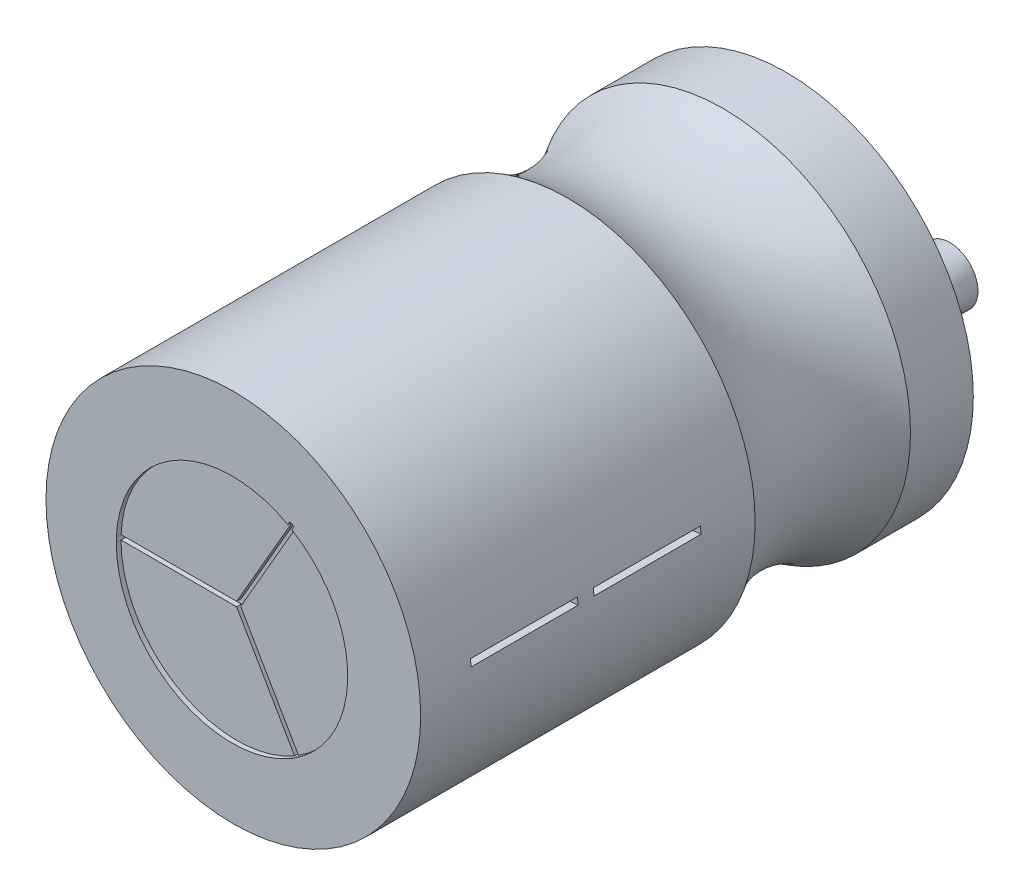
ISO-10303-21;
HEADER;
FILE_DESCRIPTION(('STEP AP214'),'2;1');
FILE_NAME('part.step','',(''),(''),'','','');
FILE_SCHEMA(('AUTOMOTIVE_DESIGN { 1 0 10303 214 1 1 1 1 }'));
ENDSEC;
DATA;
#1=APPLICATION_CONTEXT('core data for automotive mechanical design processes');
#2=APPLICATION_PROTOCOL_DEFINITION('international standard','automotive_design',2000,#1);
#3=PRODUCT_CONTEXT('',#1,'mechanical');
#4=PRODUCT('Part','Part','',(#3));
#5=PRODUCT_RELATED_PRODUCT_CATEGORY('part','',(#4));
#6=PRODUCT_DEFINITION_FORMATION('','',#4);
#7=PRODUCT_DEFINITION_CONTEXT('part definition',#1,'design');
#8=PRODUCT_DEFINITION('design','',#6,#7);
#9=PRODUCT_DEFINITION_SHAPE('','',#8);
#10=(LENGTH_UNIT() NAMED_UNIT(*) SI_UNIT(.MILLI.,.METRE.));
#11=(NAMED_UNIT(*) PLANE_ANGLE_UNIT() SI_UNIT($,.RADIAN.));
#12=(NAMED_UNIT(*) SI_UNIT($,.STERADIAN.) SOLID_ANGLE_UNIT());
#13=UNCERTAINTY_MEASURE_WITH_UNIT(LENGTH_MEASURE(1.E-05),#10,'distance_accuracy_value','');
#14=(GEOMETRIC_REPRESENTATION_CONTEXT(3) GLOBAL_UNCERTAINTY_ASSIGNED_CONTEXT((#13)) GLOBAL_UNIT_ASSIGNED_CONTEXT((#10,
#11,#12)) REPRESENTATION_CONTEXT('',''));
#15=CARTESIAN_POINT('',(0.,0.,0.));
#16=DIRECTION('',(0.,0.,1.));
#17=DIRECTION('',(1.,0.,0.));
#18=AXIS2_PLACEMENT_3D('',#15,#16,#17);
#19=CARTESIAN_POINT('',(3.82844775003185,-6.73106601717805,11.6));
#20=DIRECTION('',(-0.866025403784443,-0.499999999999992,0.));
#21=DIRECTION('',(0.499999999999992,-0.866025403784443,0.));
#22=AXIS2_PLACEMENT_3D('',#19,#20,#21);
#23=PLANE('',#22);
#24=DIRECTION('',(-0.499999999999992,0.866025403784443,0.));
#25=VECTOR('',#24,1.);
#26=CARTESIAN_POINT('',(3.82844775003185,-6.73106601717805,11.7));
#27=LINE('',#26,#25);
#28=CARTESIAN_POINT('',(1.20644870480576,-2.18963045344928,11.7));
#29=VERTEX_POINT('',#28);
#30=CARTESIAN_POINT('',(-0.0288675134594817,-0.0499999999999997,11.7));
#31=VERTEX_POINT('',#30);
#32=EDGE_CURVE('E344',#29,#31,#27,.T.);
#33=ORIENTED_EDGE('',*,*,#32,.F.);
#34=DIRECTION('',(0.,0.,1.));
#35=VECTOR('',#34,1.);
#36=CARTESIAN_POINT('',(1.20644870480576,-2.18963045344928,11.6));
#37=LINE('',#36,#35);
#38=CARTESIAN_POINT('',(1.20644870480576,-2.18963045344928,11.6));
#39=VERTEX_POINT('',#38);
#40=EDGE_CURVE('E457',#39,#29,#37,.T.);
#41=ORIENTED_EDGE('',*,*,#40,.F.);
#42=DIRECTION('',(0.499999999999992,-0.866025403784443,0.));
#43=VECTOR('',#42,1.);
#44=CARTESIAN_POINT('',(3.82844775003185,-6.73106601717805,11.6));
#45=LINE('',#44,#43);
#46=CARTESIAN_POINT('',(-0.0288675134594817,-0.0499999999999988,11.6));
#47=VERTEX_POINT('',#46);
#48=EDGE_CURVE('E396',#47,#39,#45,.T.);
#49=ORIENTED_EDGE('',*,*,#48,.F.);
#50=DIRECTION('',(0.,0.,1.));
#51=VECTOR('',#50,1.);
#52=CARTESIAN_POINT('',(-0.0288675134594817,-0.0499999999999988,11.6));
#53=LINE('',#52,#51);
#54=EDGE_CURVE('E461',#47,#31,#53,.T.);
#55=ORIENTED_EDGE('',*,*,#54,.T.);
#56=EDGE_LOOP('',(#33,#41,#49,#55));
#57=FACE_BOUND('',#56,.T.);
#58=ADVANCED_FACE('F78',(#57),#23,.F.);
#59=CARTESIAN_POINT('',(0.,-0.0499999999999997,11.6));
#60=DIRECTION('',(0.,1.,0.));
#61=DIRECTION('',(-1.,0.,0.));
#62=AXIS2_PLACEMENT_3D('',#59,#60,#61);
#63=PLANE('',#62);
#64=DIRECTION('',(0.,0.,1.));
#65=VECTOR('',#64,1.);
#66=CARTESIAN_POINT('',(-2.49949994999,-0.0499999999999994,11.6));
#67=LINE('',#66,#65);
#68=CARTESIAN_POINT('',(-2.49949994999,-0.0499999999999994,11.6));
#69=VERTEX_POINT('',#68);
#70=CARTESIAN_POINT('',(-2.49949994999,-0.0499999999999994,11.7));
#71=VERTEX_POINT('',#70);
#72=EDGE_CURVE('E465',#69,#71,#67,.T.);
#73=ORIENTED_EDGE('',*,*,#72,.T.);
#74=DIRECTION('',(1.,0.,0.));
#75=VECTOR('',#74,1.);
#76=CARTESIAN_POINT('',(0.,-0.0499999999999997,11.7));
#77=LINE('',#76,#75);
#78=EDGE_CURVE('E340',#71,#31,#77,.T.);
#79=ORIENTED_EDGE('',*,*,#78,.T.);
#80=ORIENTED_EDGE('',*,*,#54,.F.);
#81=DIRECTION('',(-1.,0.,0.));
#82=VECTOR('',#81,1.);
#83=CARTESIAN_POINT('',(0.,-0.0499999999999997,11.6));
#84=LINE('',#83,#82);
#85=EDGE_CURVE('E393',#47,#69,#84,.T.);
#86=ORIENTED_EDGE('',*,*,#85,.T.);
#87=EDGE_LOOP('',(#73,#79,#80,#86));
#88=FACE_BOUND('',#87,.T.);
#89=ADVANCED_FACE('F550',(#88),#63,.T.);
#90=CARTESIAN_POINT('',(0.,0.,0.));
#91=DIRECTION('',(0.,0.,1.));
#92=DIRECTION('',(1.,0.,0.));
#93=AXIS2_PLACEMENT_3D('',#90,#91,#92);
#94=PLANE('',#93);
#95=CARTESIAN_POINT('',(-1.50000000000006,0.,0.));
#96=DIRECTION('',(0.,0.,1.));
#97=DIRECTION('',(1.,0.,0.));
#98=AXIS2_PLACEMENT_3D('',#95,#96,#97);
#99=CIRCLE('',#98,0.6);
#100=CARTESIAN_POINT('',(-0.900000000000057,0.,0.));
#101=VERTEX_POINT('',#100);
#102=EDGE_CURVE('E480',#101,#101,#99,.F.);
#103=ORIENTED_EDGE('',*,*,#102,.F.);
#104=EDGE_LOOP('',(#103));
#105=FACE_BOUND('',#104,.T.);
#106=CARTESIAN_POINT('',(0.,0.,0.));
#107=DIRECTION('',(0.,0.,1.));
#108=DIRECTION('',(1.,0.,0.));
#109=AXIS2_PLACEMENT_3D('',#106,#107,#108);
#110=CIRCLE('',#109,4.);
#111=CARTESIAN_POINT('',(4.,0.,0.));
#112=VERTEX_POINT('',#111);
#113=EDGE_CURVE('E476',#112,#112,#110,.T.);
#114=ORIENTED_EDGE('',*,*,#113,.F.);
#115=EDGE_LOOP('',(#114));
#116=FACE_BOUND('',#115,.T.);
#117=CARTESIAN_POINT('',(1.50000000000006,0.,0.));
#118=DIRECTION('',(0.,0.,1.));
#119=DIRECTION('',(1.,0.,0.));
#120=AXIS2_PLACEMENT_3D('',#117,#118,#119);
#121=CIRCLE('',#120,0.6);
#122=CARTESIAN_POINT('',(2.10000000000006,0.,0.));
#123=VERTEX_POINT('',#122);
#124=EDGE_CURVE('E492',#123,#123,#121,.F.);
#125=ORIENTED_EDGE('',*,*,#124,.F.);
#126=EDGE_LOOP('',(#125));
#127=FACE_BOUND('',#126,.T.);
#128=ADVANCED_FACE('F568',(#105,#116,#127),#94,.F.);
#129=CARTESIAN_POINT('',(0.,0.,11.8));
#130=DIRECTION('',(0.,0.,1.));
#131=DIRECTION('',(1.,0.,0.));
#132=AXIS2_PLACEMENT_3D('',#129,#130,#131);
#133=PLANE('',#132);
#134=CARTESIAN_POINT('',(-0.0288675134594817,-0.0499999999999988,11.8));
#135=DIRECTION('',(0.,0.,1.));
#136=DIRECTION('',(1.,0.,0.));
#137=AXIS2_PLACEMENT_3D('',#134,#135,#136);
#138=CIRCLE('',#137,2.47063243653052);
#139=CARTESIAN_POINT('',(1.1628944370446,2.11419224880034,11.8));
#140=VERTEX_POINT('',#139);
#141=CARTESIAN_POINT('',(-2.4974753471254,0.0499999999999994,11.8));
#142=VERTEX_POINT('',#141);
#143=EDGE_CURVE('E331',#140,#142,#138,.T.);
#144=ORIENTED_EDGE('',*,*,#143,.F.);
#145=DIRECTION('',(0.50000000000002,0.866025403784427,0.));
#146=VECTOR('',#145,1.);
#147=CARTESIAN_POINT('',(-3.91505029041043,-6.6810660171778,11.8));
#148=LINE('',#147,#146);
#149=CARTESIAN_POINT('',(1.20644870480583,2.18963045344925,11.8));
#150=VERTEX_POINT('',#149);
#151=EDGE_CURVE('E416',#140,#150,#148,.T.);
#152=ORIENTED_EDGE('',*,*,#151,.T.);
#153=CARTESIAN_POINT('',(0.,0.,11.8));
#154=DIRECTION('',(0.,0.,1.));
#155=DIRECTION('',(1.,0.,0.));
#156=AXIS2_PLACEMENT_3D('',#153,#154,#155);
#157=CIRCLE('',#156,2.5);
#158=CARTESIAN_POINT('',(1.29305124518423,2.13963045344927,11.8));
#159=VERTEX_POINT('',#158);
#160=EDGE_CURVE('E385',#159,#150,#157,.T.);
#161=ORIENTED_EDGE('',*,*,#160,.F.);
#162=DIRECTION('',(0.500000000000004,0.866025403784436,0.));
#163=VECTOR('',#162,1.);
#164=CARTESIAN_POINT('',(-3.82844775003191,-6.73106601717795,11.8));
#165=LINE('',#164,#163);
#166=CARTESIAN_POINT('',(1.249496977423,2.06419224880036,11.8));
#167=VERTEX_POINT('',#166);
#168=EDGE_CURVE('E434',#167,#159,#165,.T.);
#169=ORIENTED_EDGE('',*,*,#168,.F.);
#170=CARTESIAN_POINT('',(1.29203894375187,-2.13787709593598,11.8));
#171=VERTEX_POINT('',#170);
#172=EDGE_CURVE('E323',#171,#167,#138,.T.);
#173=ORIENTED_EDGE('',*,*,#172,.F.);
#174=DIRECTION('',(0.49999999999998,-0.86602540378445,0.));
#175=VECTOR('',#174,1.);
#176=CARTESIAN_POINT('',(3.91505029041023,-6.68106601717817,11.8));
#177=LINE('',#176,#175);
#178=CARTESIAN_POINT('',(1.29305124518417,-2.1396304534493,11.8));
#179=VERTEX_POINT('',#178);
#180=EDGE_CURVE('E431',#171,#179,#177,.T.);
#181=ORIENTED_EDGE('',*,*,#180,.T.);
#182=CARTESIAN_POINT('',(0.,0.,11.8));
#183=DIRECTION('',(0.,0.,1.));
#184=DIRECTION('',(1.,0.,0.));
#185=AXIS2_PLACEMENT_3D('',#182,#183,#184);
#186=CIRCLE('',#185,2.5);
#187=CARTESIAN_POINT('',(1.20644870480576,-2.18963045344928,11.8));
#188=VERTEX_POINT('',#187);
#189=EDGE_CURVE('E427',#188,#179,#186,.T.);
#190=ORIENTED_EDGE('',*,*,#189,.F.);
#191=CARTESIAN_POINT('',(-2.49949994999,-0.0499999999998698,11.8));
#192=VERTEX_POINT('',#191);
#193=EDGE_CURVE('E335',#192,#188,#138,.T.);
#194=ORIENTED_EDGE('',*,*,#193,.F.);
#195=CARTESIAN_POINT('',(0.,0.,11.8));
#196=DIRECTION('',(0.,0.,1.));
#197=DIRECTION('',(1.,0.,0.));
#198=AXIS2_PLACEMENT_3D('',#195,#196,#197);
#199=CIRCLE('',#198,2.5);
#200=CARTESIAN_POINT('',(-2.49949994999,0.0499999999999994,11.8));
#201=VERTEX_POINT('',#200);
#202=EDGE_CURVE('E423',#201,#192,#199,.T.);
#203=ORIENTED_EDGE('',*,*,#202,.F.);
#204=DIRECTION('',(-1.,0.,0.));
#205=VECTOR('',#204,1.);
#206=CARTESIAN_POINT('',(0.,0.0499999999999997,11.8));
#207=LINE('',#206,#205);
#208=EDGE_CURVE('E419',#142,#201,#207,.T.);
#209=ORIENTED_EDGE('',*,*,#208,.F.);
#210=EDGE_LOOP('',(#144,#152,#161,#169,#173,#181,#190,#194,#203,#209));
#211=FACE_BOUND('',#210,.T.);
#212=CARTESIAN_POINT('',(0.,0.,11.8));
#213=DIRECTION('',(0.,0.,1.));
#214=DIRECTION('',(1.,0.,0.));
#215=AXIS2_PLACEMENT_3D('',#212,#213,#214);
#216=CIRCLE('',#215,4.);
#217=CARTESIAN_POINT('',(4.,0.,11.8));
#218=VERTEX_POINT('',#217);
#219=EDGE_CURVE('E444',#218,#218,#216,.T.);
#220=ORIENTED_EDGE('',*,*,#219,.T.);
#221=EDGE_LOOP('',(#220));
#222=FACE_BOUND('',#221,.T.);
#223=ADVANCED_FACE('F520',(#211,#222),#133,.T.);
#224=CARTESIAN_POINT('',(0.,0.,12.));
#225=DIRECTION('',(0.,0.,-1.));
#226=DIRECTION('',(-1.,0.,0.));
#227=AXIS2_PLACEMENT_3D('',#224,#225,#226);
#228=CYLINDRICAL_SURFACE('',#227,4.);
#229=CARTESIAN_POINT('',(0.,0.,8.08332286425552));
#230=DIRECTION('',(0.,0.,-1.));
#231=DIRECTION('',(0.996234762972635,0.0866965803527307,0.));
#232=AXIS2_PLACEMENT_3D('',#229,#230,#231);
#233=CIRCLE('',#232,4.);
#234=CARTESIAN_POINT('',(3.96965048411367,0.491807923864735,8.08332286425552));
#235=VERTEX_POINT('',#234);
#236=CARTESIAN_POINT('',(3.98493905189054,0.346786321410923,8.08332286425552));
#237=VERTEX_POINT('',#236);
#238=EDGE_CURVE('E272',#235,#237,#233,.T.);
#239=ORIENTED_EDGE('',*,*,#238,.F.);
#240=DIRECTION('',(0.,0.,-1.));
#241=VECTOR('',#240,1.);
#242=CARTESIAN_POINT('',(3.96965048411367,0.491807923864735,8.08332286425552));
#243=LINE('',#242,#241);
#244=CARTESIAN_POINT('',(3.96965048411367,0.491807923864736,5.7986006420333));
#245=VERTEX_POINT('',#244);
#246=EDGE_CURVE('E94',#235,#245,#243,.T.);
#247=ORIENTED_EDGE('',*,*,#246,.T.);
#248=CARTESIAN_POINT('',(0.,0.,5.7986006420333));
#249=DIRECTION('',(0.,0.,-1.));
#250=DIRECTION('',(0.996234762972635,0.0866965803527307,0.));
#251=AXIS2_PLACEMENT_3D('',#248,#249,#250);
#252=CIRCLE('',#251,4.);
#253=CARTESIAN_POINT('',(3.98493905189054,0.346786321410923,5.7986006420333));
#254=VERTEX_POINT('',#253);
#255=EDGE_CURVE('E251',#245,#254,#252,.T.);
#256=ORIENTED_EDGE('',*,*,#255,.T.);
#257=DIRECTION('',(0.,0.,1.));
#258=VECTOR('',#257,1.);
#259=CARTESIAN_POINT('',(3.98493905189054,0.346786321410923,5.7986006420333));
#260=LINE('',#259,#258);
#261=EDGE_CURVE('E234',#254,#237,#260,.T.);
#262=ORIENTED_EDGE('',*,*,#261,.T.);
#263=EDGE_LOOP('',(#239,#247,#256,#262));
#264=FACE_BOUND('',#263,.T.);
#265=CARTESIAN_POINT('',(0.,0.,10.7083228642555));
#266=DIRECTION('',(0.,0.,-1.));
#267=DIRECTION('',(0.996234762972635,0.0866965803527307,0.));
#268=AXIS2_PLACEMENT_3D('',#265,#266,#267);
#269=CIRCLE('',#268,4.);
#270=CARTESIAN_POINT('',(3.96965048411367,0.491807923864735,10.7083228642555));
#271=VERTEX_POINT('',#270);
#272=CARTESIAN_POINT('',(3.98493905189054,0.346786321410923,10.7083228642555));
#273=VERTEX_POINT('',#272);
#274=EDGE_CURVE('E307',#271,#273,#269,.T.);
#275=ORIENTED_EDGE('',*,*,#274,.F.);
#276=DIRECTION('',(0.,0.,-1.));
#277=VECTOR('',#276,1.);
#278=CARTESIAN_POINT('',(3.96965048411367,0.491807923864735,10.7083228642555));
#279=LINE('',#278,#277);
#280=CARTESIAN_POINT('',(3.96965048411367,0.491807923864736,8.42360064203329));
#281=VERTEX_POINT('',#280);
#282=EDGE_CURVE('E102',#271,#281,#279,.T.);
#283=ORIENTED_EDGE('',*,*,#282,.T.);
#284=CARTESIAN_POINT('',(0.,0.,8.42360064203329));
#285=DIRECTION('',(0.,0.,-1.));
#286=DIRECTION('',(0.996234762972635,0.0866965803527307,0.));
#287=AXIS2_PLACEMENT_3D('',#284,#285,#286);
#288=CIRCLE('',#287,4.);
#289=CARTESIAN_POINT('',(3.98493905189054,0.346786321410923,8.42360064203329));
#290=VERTEX_POINT('',#289);
#291=EDGE_CURVE('E289',#281,#290,#288,.T.);
#292=ORIENTED_EDGE('',*,*,#291,.T.);
#293=DIRECTION('',(0.,0.,1.));
#294=VECTOR('',#293,1.);
#295=CARTESIAN_POINT('',(3.98493905189054,0.346786321410923,8.42360064203329));
#296=LINE('',#295,#294);
#297=EDGE_CURVE('E282',#290,#273,#296,.T.);
#298=ORIENTED_EDGE('',*,*,#297,.T.);
#299=EDGE_LOOP('',(#275,#283,#292,#298));
#300=FACE_BOUND('',#299,.T.);
#301=CARTESIAN_POINT('',(0.,0.,4.6583123951777));
#302=DIRECTION('',(0.,0.,-1.));
#303=DIRECTION('',(-1.,0.,0.));
#304=AXIS2_PLACEMENT_3D('',#301,#302,#303);
#305=CIRCLE('',#304,4.);
#306=CARTESIAN_POINT('',(-4.,0.,4.6583123951777));
#307=VERTEX_POINT('',#306);
#308=EDGE_CURVE('E380',#307,#307,#305,.F.);
#309=ORIENTED_EDGE('',*,*,#308,.T.);
#310=EDGE_LOOP('',(#309));
#311=FACE_BOUND('',#310,.T.);
#312=ORIENTED_EDGE('',*,*,#219,.F.);
#313=EDGE_LOOP('',(#312));
#314=FACE_BOUND('',#313,.T.);
#315=ADVANCED_FACE('F80',(#264,#300,#311,#314),#228,.T.);
#316=CARTESIAN_POINT('',(-3.91505029041043,-6.6810660171778,11.6));
#317=DIRECTION('',(0.866025403784427,-0.50000000000002,0.));
#318=DIRECTION('',(0.50000000000002,0.866025403784427,0.));
#319=AXIS2_PLACEMENT_3D('',#316,#317,#318);
#320=PLANE('',#319);
#321=DIRECTION('',(0.,0.,1.));
#322=VECTOR('',#321,1.);
#323=CARTESIAN_POINT('',(1.1628944370446,2.11419224880034,11.7));
#324=LINE('',#323,#322);
#325=CARTESIAN_POINT('',(1.1628944370446,2.11419224880034,11.7));
#326=VERTEX_POINT('',#325);
#327=EDGE_CURVE('E369',#326,#140,#324,.T.);
#328=ORIENTED_EDGE('',*,*,#327,.F.);
#329=DIRECTION('',(-0.50000000000002,-0.866025403784427,0.));
#330=VECTOR('',#329,1.);
#331=CARTESIAN_POINT('',(-3.91505029041043,-6.6810660171778,11.7));
#332=LINE('',#331,#330);
#333=CARTESIAN_POINT('',(-0.0288675134594793,0.0499999999999997,11.7));
#334=VERTEX_POINT('',#333);
#335=EDGE_CURVE('E336',#326,#334,#332,.T.);
#336=ORIENTED_EDGE('',*,*,#335,.T.);
#337=DIRECTION('',(0.,0.,1.));
#338=VECTOR('',#337,1.);
#339=CARTESIAN_POINT('',(-0.0288675134594793,0.050000000000001,11.6));
#340=LINE('',#339,#338);
#341=CARTESIAN_POINT('',(-0.0288675134594793,0.050000000000001,11.6));
#342=VERTEX_POINT('',#341);
#343=EDGE_CURVE('E415',#342,#334,#340,.T.);
#344=ORIENTED_EDGE('',*,*,#343,.F.);
#345=DIRECTION('',(0.50000000000002,0.866025403784427,0.));
#346=VECTOR('',#345,1.);
#347=CARTESIAN_POINT('',(-3.91505029041043,-6.6810660171778,11.6));
#348=LINE('',#347,#346);
#349=CARTESIAN_POINT('',(1.20644870480583,2.18963045344925,11.6));
#350=VERTEX_POINT('',#349);
#351=EDGE_CURVE('E381',#342,#350,#348,.T.);
#352=ORIENTED_EDGE('',*,*,#351,.T.);
#353=DIRECTION('',(0.,0.,1.));
#354=VECTOR('',#353,1.);
#355=CARTESIAN_POINT('',(1.20644870480583,2.18963045344925,11.6));
#356=LINE('',#355,#354);
#357=EDGE_CURVE('E440',#350,#150,#356,.T.);
#358=ORIENTED_EDGE('',*,*,#357,.T.);
#359=ORIENTED_EDGE('',*,*,#151,.F.);
#360=EDGE_LOOP('',(#328,#336,#344,#352,#358,#359));
#361=FACE_BOUND('',#360,.T.);
#362=ADVANCED_FACE('F503',(#361),#320,.T.);
#363=CARTESIAN_POINT('',(0.,0.,11.6));
#364=DIRECTION('',(0.,0.,1.));
#365=DIRECTION('',(1.,0.,0.));
#366=AXIS2_PLACEMENT_3D('',#363,#364,#365);
#367=CYLINDRICAL_SURFACE('',#366,2.5);
#368=ORIENTED_EDGE('',*,*,#160,.T.);
#369=ORIENTED_EDGE('',*,*,#357,.F.);
#370=CARTESIAN_POINT('',(0.,0.,11.6));
#371=DIRECTION('',(0.,0.,1.));
#372=DIRECTION('',(1.,0.,0.));
#373=AXIS2_PLACEMENT_3D('',#370,#371,#372);
#374=CIRCLE('',#373,2.5);
#375=CARTESIAN_POINT('',(1.29305124518423,2.13963045344927,11.6));
#376=VERTEX_POINT('',#375);
#377=EDGE_CURVE('E411',#376,#350,#374,.T.);
#378=ORIENTED_EDGE('',*,*,#377,.F.);
#379=DIRECTION('',(0.,0.,1.));
#380=VECTOR('',#379,1.);
#381=CARTESIAN_POINT('',(1.29305124518423,2.13963045344927,11.6));
#382=LINE('',#381,#380);
#383=EDGE_CURVE('E445',#376,#159,#382,.T.);
#384=ORIENTED_EDGE('',*,*,#383,.T.);
#385=EDGE_LOOP('',(#368,#369,#378,#384));
#386=FACE_BOUND('',#385,.T.);
#387=ADVANCED_FACE('F515',(#386),#367,.F.);
#388=CARTESIAN_POINT('',(-3.82844775003191,-6.73106601717795,11.6));
#389=DIRECTION('',(0.866025403784436,-0.500000000000004,0.));
#390=DIRECTION('',(0.500000000000004,0.866025403784436,0.));
#391=AXIS2_PLACEMENT_3D('',#388,#389,#390);
#392=PLANE('',#391);
#393=DIRECTION('',(-0.500000000000004,-0.866025403784436,0.));
#394=VECTOR('',#393,1.);
#395=CARTESIAN_POINT('',(-3.82844775003191,-6.73106601717795,11.7));
#396=LINE('',#395,#394);
#397=CARTESIAN_POINT('',(1.249496977423,2.06419224880036,11.7));
#398=VERTEX_POINT('',#397);
#399=CARTESIAN_POINT('',(0.0577350269189618,0.,11.7));
#400=VERTEX_POINT('',#399);
#401=EDGE_CURVE('E351',#398,#400,#396,.T.);
#402=ORIENTED_EDGE('',*,*,#401,.F.);
#403=DIRECTION('',(0.,0.,1.));
#404=VECTOR('',#403,1.);
#405=CARTESIAN_POINT('',(1.249496977423,2.06419224880036,11.7));
#406=LINE('',#405,#404);
#407=EDGE_CURVE('E365',#398,#167,#406,.T.);
#408=ORIENTED_EDGE('',*,*,#407,.T.);
#409=ORIENTED_EDGE('',*,*,#168,.T.);
#410=ORIENTED_EDGE('',*,*,#383,.F.);
#411=DIRECTION('',(0.500000000000004,0.866025403784436,0.));
#412=VECTOR('',#411,1.);
#413=CARTESIAN_POINT('',(-3.82844775003191,-6.73106601717795,11.6));
#414=LINE('',#413,#412);
#415=CARTESIAN_POINT('',(0.0577350269189618,0.,11.6));
#416=VERTEX_POINT('',#415);
#417=EDGE_CURVE('E407',#416,#376,#414,.T.);
#418=ORIENTED_EDGE('',*,*,#417,.F.);
#419=DIRECTION('',(0.,0.,1.));
#420=VECTOR('',#419,1.);
#421=CARTESIAN_POINT('',(0.0577350269189618,0.,11.6));
#422=LINE('',#421,#420);
#423=EDGE_CURVE('E449',#416,#400,#422,.T.);
#424=ORIENTED_EDGE('',*,*,#423,.T.);
#425=EDGE_LOOP('',(#402,#408,#409,#410,#418,#424));
#426=FACE_BOUND('',#425,.T.);
#427=ADVANCED_FACE('F572',(#426),#392,.F.);
#428=CARTESIAN_POINT('',(3.91505029041023,-6.68106601717817,11.6));
#429=DIRECTION('',(-0.866025403784451,-0.49999999999998,0.));
#430=DIRECTION('',(0.49999999999998,-0.866025403784451,0.));
#431=AXIS2_PLACEMENT_3D('',#428,#429,#430);
#432=PLANE('',#431);
#433=DIRECTION('',(0.,0.,1.));
#434=VECTOR('',#433,1.);
#435=CARTESIAN_POINT('',(1.29203894375187,-2.13787709593598,11.7));
#436=LINE('',#435,#434);
#437=CARTESIAN_POINT('',(1.29203894375187,-2.13787709593598,11.7));
#438=VERTEX_POINT('',#437);
#439=EDGE_CURVE('E362',#438,#171,#436,.T.);
#440=ORIENTED_EDGE('',*,*,#439,.F.);
#441=DIRECTION('',(-0.49999999999998,0.866025403784451,0.));
#442=VECTOR('',#441,1.);
#443=CARTESIAN_POINT('',(3.91505029041023,-6.68106601717817,11.7));
#444=LINE('',#443,#442);
#445=EDGE_CURVE('E347',#438,#400,#444,.T.);
#446=ORIENTED_EDGE('',*,*,#445,.T.);
#447=ORIENTED_EDGE('',*,*,#423,.F.);
#448=DIRECTION('',(0.49999999999998,-0.86602540378445,0.));
#449=VECTOR('',#448,1.);
#450=CARTESIAN_POINT('',(3.91505029041023,-6.68106601717817,11.6));
#451=LINE('',#450,#449);
#452=CARTESIAN_POINT('',(1.29305124518417,-2.1396304534493,11.6));
#453=VERTEX_POINT('',#452);
#454=EDGE_CURVE('E404',#416,#453,#451,.T.);
#455=ORIENTED_EDGE('',*,*,#454,.T.);
#456=DIRECTION('',(0.,0.,1.));
#457=VECTOR('',#456,1.);
#458=CARTESIAN_POINT('',(1.29305124518417,-2.1396304534493,11.6));
#459=LINE('',#458,#457);
#460=EDGE_CURVE('E453',#453,#179,#459,.T.);
#461=ORIENTED_EDGE('',*,*,#460,.T.);
#462=ORIENTED_EDGE('',*,*,#180,.F.);
#463=EDGE_LOOP('',(#440,#446,#447,#455,#461,#462));
#464=FACE_BOUND('',#463,.T.);
#465=ADVANCED_FACE('F540',(#464),#432,.T.);
#466=CARTESIAN_POINT('',(0.,0.,11.6));
#467=DIRECTION('',(0.,0.,1.));
#468=DIRECTION('',(1.,0.,0.));
#469=AXIS2_PLACEMENT_3D('',#466,#467,#468);
#470=CYLINDRICAL_SURFACE('',#469,2.5);
#471=ORIENTED_EDGE('',*,*,#189,.T.);
#472=ORIENTED_EDGE('',*,*,#460,.F.);
#473=CARTESIAN_POINT('',(0.,0.,11.6));
#474=DIRECTION('',(0.,0.,1.));
#475=DIRECTION('',(1.,0.,0.));
#476=AXIS2_PLACEMENT_3D('',#473,#474,#475);
#477=CIRCLE('',#476,2.5);
#478=EDGE_CURVE('E400',#39,#453,#477,.T.);
#479=ORIENTED_EDGE('',*,*,#478,.F.);
#480=ORIENTED_EDGE('',*,*,#40,.T.);
#481=DIRECTION('',(0.,0.,1.));
#482=VECTOR('',#481,1.);
#483=CARTESIAN_POINT('',(1.20644870480576,-2.18963045344928,11.7));
#484=LINE('',#483,#482);
#485=EDGE_CURVE('E358',#29,#188,#484,.T.);
#486=ORIENTED_EDGE('',*,*,#485,.T.);
#487=EDGE_LOOP('',(#471,#472,#479,#480,#486));
#488=FACE_BOUND('',#487,.T.);
#489=ADVANCED_FACE('F534',(#488),#470,.F.);
#490=CARTESIAN_POINT('',(0.,0.,11.6));
#491=DIRECTION('',(0.,0.,1.));
#492=DIRECTION('',(1.,0.,0.));
#493=AXIS2_PLACEMENT_3D('',#490,#491,#492);
#494=CYLINDRICAL_SURFACE('',#493,2.5);
#495=ORIENTED_EDGE('',*,*,#202,.T.);
#496=DIRECTION('',(0.,0.,1.));
#497=VECTOR('',#496,1.);
#498=CARTESIAN_POINT('',(-2.49949994999,-0.04999999999987,11.75));
#499=LINE('',#498,#497);
#500=EDGE_CURVE('E354',#192,#71,#499,.F.);
#501=ORIENTED_EDGE('',*,*,#500,.T.);
#502=ORIENTED_EDGE('',*,*,#72,.F.);
#503=CARTESIAN_POINT('',(0.,0.,11.6));
#504=DIRECTION('',(0.,0.,1.));
#505=DIRECTION('',(1.,0.,0.));
#506=AXIS2_PLACEMENT_3D('',#503,#504,#505);
#507=CIRCLE('',#506,2.5);
#508=CARTESIAN_POINT('',(-2.49949994999,0.0499999999999994,11.6));
#509=VERTEX_POINT('',#508);
#510=EDGE_CURVE('E389',#509,#69,#507,.T.);
#511=ORIENTED_EDGE('',*,*,#510,.F.);
#512=DIRECTION('',(0.,0.,1.));
#513=VECTOR('',#512,1.);
#514=CARTESIAN_POINT('',(-2.49949994999,0.0499999999999994,11.6));
#515=LINE('',#514,#513);
#516=EDGE_CURVE('E469',#509,#201,#515,.T.);
#517=ORIENTED_EDGE('',*,*,#516,.T.);
#518=EDGE_LOOP('',(#495,#501,#502,#511,#517));
#519=FACE_BOUND('',#518,.T.);
#520=ADVANCED_FACE('F553',(#519),#494,.F.);
#521=CARTESIAN_POINT('',(0.,0.0499999999999997,11.6));
#522=DIRECTION('',(0.,1.,0.));
#523=DIRECTION('',(-1.,0.,0.));
#524=AXIS2_PLACEMENT_3D('',#521,#522,#523);
#525=PLANE('',#524);
#526=DIRECTION('',(1.,0.,0.));
#527=VECTOR('',#526,1.);
#528=CARTESIAN_POINT('',(0.,0.0499999999999997,11.7));
#529=LINE('',#528,#527);
#530=CARTESIAN_POINT('',(-2.4974753471254,0.0499999999999994,11.7));
#531=VERTEX_POINT('',#530);
#532=EDGE_CURVE('E87',#531,#334,#529,.T.);
#533=ORIENTED_EDGE('',*,*,#532,.F.);
#534=DIRECTION('',(0.,0.,1.));
#535=VECTOR('',#534,1.);
#536=CARTESIAN_POINT('',(-2.4974753471254,0.0499999999999994,11.7));
#537=LINE('',#536,#535);
#538=EDGE_CURVE('E13',#531,#142,#537,.T.);
#539=ORIENTED_EDGE('',*,*,#538,.T.);
#540=ORIENTED_EDGE('',*,*,#208,.T.);
#541=ORIENTED_EDGE('',*,*,#516,.F.);
#542=DIRECTION('',(-1.,0.,0.));
#543=VECTOR('',#542,1.);
#544=CARTESIAN_POINT('',(0.,0.0499999999999997,11.6));
#545=LINE('',#544,#543);
#546=EDGE_CURVE('E384',#342,#509,#545,.T.);
#547=ORIENTED_EDGE('',*,*,#546,.F.);
#548=ORIENTED_EDGE('',*,*,#343,.T.);
#549=EDGE_LOOP('',(#533,#539,#540,#541,#547,#548));
#550=FACE_BOUND('',#549,.T.);
#551=ADVANCED_FACE('F507',(#550),#525,.F.);
#552=CARTESIAN_POINT('',(0.,-8.94142135623731,11.6));
#553=DIRECTION('',(0.,0.,1.));
#554=DIRECTION('',(1.,0.,0.));
#555=AXIS2_PLACEMENT_3D('',#552,#553,#554);
#556=PLANE('',#555);
#557=ORIENTED_EDGE('',*,*,#351,.F.);
#558=ORIENTED_EDGE('',*,*,#546,.T.);
#559=ORIENTED_EDGE('',*,*,#510,.T.);
#560=ORIENTED_EDGE('',*,*,#85,.F.);
#561=ORIENTED_EDGE('',*,*,#48,.T.);
#562=ORIENTED_EDGE('',*,*,#478,.T.);
#563=ORIENTED_EDGE('',*,*,#454,.F.);
#564=ORIENTED_EDGE('',*,*,#417,.T.);
#565=ORIENTED_EDGE('',*,*,#377,.T.);
#566=EDGE_LOOP('',(#557,#558,#559,#560,#561,#562,#563,#564,#565));
#567=FACE_BOUND('',#566,.T.);
#568=ADVANCED_FACE('F510',(#567),#556,.T.);
#569=CARTESIAN_POINT('',(0.,0.,3.));
#570=DIRECTION('',(0.,0.,-1.));
#571=DIRECTION('',(-1.,0.,0.));
#572=AXIS2_PLACEMENT_3D('',#569,#570,#571);
#573=TOROIDAL_SURFACE('',#572,6.5,3.);
#574=ORIENTED_EDGE('',*,*,#308,.F.);
#575=EDGE_LOOP('',(#574));
#576=FACE_BOUND('',#575,.T.);
#577=CARTESIAN_POINT('',(0.,0.,1.3416876048223));
#578=DIRECTION('',(0.,0.,1.));
#579=DIRECTION('',(1.,0.,0.));
#580=AXIS2_PLACEMENT_3D('',#577,#578,#579);
#581=CIRCLE('',#580,4.);
#582=CARTESIAN_POINT('',(4.,0.,1.3416876048223));
#583=VERTEX_POINT('',#582);
#584=EDGE_CURVE('E420',#583,#583,#581,.F.);
#585=ORIENTED_EDGE('',*,*,#584,.F.);
#586=EDGE_LOOP('',(#585));
#587=FACE_BOUND('',#586,.T.);
#588=ADVANCED_FACE('F580',(#576,#587),#573,.F.);
#589=ORIENTED_EDGE('',*,*,#584,.T.);
#590=EDGE_LOOP('',(#589));
#591=FACE_BOUND('',#590,.T.);
#592=ORIENTED_EDGE('',*,*,#113,.T.);
#593=EDGE_LOOP('',(#592));
#594=FACE_BOUND('',#593,.T.);
#595=ADVANCED_FACE('F583',(#591,#594),#228,.T.);
#596=CARTESIAN_POINT('',(-1.50000000000006,0.,-2.));
#597=DIRECTION('',(0.,0.,1.));
#598=DIRECTION('',(1.,0.,0.));
#599=AXIS2_PLACEMENT_3D('',#596,#597,#598);
#600=CYLINDRICAL_SURFACE('',#599,0.6);
#601=CARTESIAN_POINT('',(-1.50000000000006,0.,-2.));
#602=DIRECTION('',(0.,0.,-1.));
#603=DIRECTION('',(-1.,0.,0.));
#604=AXIS2_PLACEMENT_3D('',#601,#602,#603);
#605=CIRCLE('',#604,0.6);
#606=CARTESIAN_POINT('',(-2.10000000000006,0.,-2.));
#607=VERTEX_POINT('',#606);
#608=EDGE_CURVE('E376',#607,#607,#605,.T.);
#609=ORIENTED_EDGE('',*,*,#608,.F.);
#610=EDGE_LOOP('',(#609));
#611=FACE_BOUND('',#610,.T.);
#612=ORIENTED_EDGE('',*,*,#102,.T.);
#613=EDGE_LOOP('',(#612));
#614=FACE_BOUND('',#613,.T.);
#615=ADVANCED_FACE('F585',(#611,#614),#600,.T.);
#616=CARTESIAN_POINT('',(-1.50000000000006,0.,-2.));
#617=DIRECTION('',(0.,0.,-1.));
#618=DIRECTION('',(-1.,0.,0.));
#619=AXIS2_PLACEMENT_3D('',#616,#617,#618);
#620=PLANE('',#619);
#621=ORIENTED_EDGE('',*,*,#608,.T.);
#622=EDGE_LOOP('',(#621));
#623=FACE_BOUND('',#622,.T.);
#624=ADVANCED_FACE('F588',(#623),#620,.T.);
#625=CARTESIAN_POINT('',(1.50000000000006,0.,-2.));
#626=DIRECTION('',(0.,0.,1.));
#627=DIRECTION('',(1.,0.,0.));
#628=AXIS2_PLACEMENT_3D('',#625,#626,#627);
#629=CYLINDRICAL_SURFACE('',#628,0.6);
#630=CARTESIAN_POINT('',(1.50000000000006,0.,-2.));
#631=DIRECTION('',(0.,0.,-1.));
#632=DIRECTION('',(1.,0.,0.));
#633=AXIS2_PLACEMENT_3D('',#630,#631,#632);
#634=CIRCLE('',#633,0.6);
#635=CARTESIAN_POINT('',(2.10000000000006,0.,-2.));
#636=VERTEX_POINT('',#635);
#637=EDGE_CURVE('E372',#636,#636,#634,.T.);
#638=ORIENTED_EDGE('',*,*,#637,.F.);
#639=EDGE_LOOP('',(#638));
#640=FACE_BOUND('',#639,.T.);
#641=ORIENTED_EDGE('',*,*,#124,.T.);
#642=EDGE_LOOP('',(#641));
#643=FACE_BOUND('',#642,.T.);
#644=ADVANCED_FACE('F592',(#640,#643),#629,.T.);
#645=CARTESIAN_POINT('',(1.50000000000006,0.,-2.));
#646=DIRECTION('',(0.,0.,1.));
#647=DIRECTION('',(1.,0.,0.));
#648=AXIS2_PLACEMENT_3D('',#645,#646,#647);
#649=PLANE('',#648);
#650=ORIENTED_EDGE('',*,*,#637,.T.);
#651=EDGE_LOOP('',(#650));
#652=FACE_BOUND('',#651,.T.);
#653=ADVANCED_FACE('F596',(#652),#649,.F.);
#654=CARTESIAN_POINT('',(-0.0288675134594817,-0.0499999999999988,11.7));
#655=DIRECTION('',(0.,0.,1.));
#656=DIRECTION('',(1.,0.,0.));
#657=AXIS2_PLACEMENT_3D('',#654,#655,#656);
#658=PLANE('',#657);
#659=CARTESIAN_POINT('',(-0.0288675134594817,-0.0499999999999988,11.7));
#660=DIRECTION('',(0.,0.,1.));
#661=DIRECTION('',(1.,0.,0.));
#662=AXIS2_PLACEMENT_3D('',#659,#660,#661);
#663=CIRCLE('',#662,2.47063243653052);
#664=EDGE_CURVE('E332',#326,#531,#663,.T.);
#665=ORIENTED_EDGE('',*,*,#664,.T.);
#666=ORIENTED_EDGE('',*,*,#532,.T.);
#667=ORIENTED_EDGE('',*,*,#335,.F.);
#668=EDGE_LOOP('',(#665,#666,#667));
#669=FACE_BOUND('',#668,.T.);
#670=ADVANCED_FACE('F497',(#669),#658,.T.);
#671=CARTESIAN_POINT('',(-0.0288675134594817,-0.0499999999999988,11.7));
#672=DIRECTION('',(0.,0.,1.));
#673=DIRECTION('',(1.,0.,0.));
#674=AXIS2_PLACEMENT_3D('',#671,#672,#673);
#675=CYLINDRICAL_SURFACE('',#674,2.47063243653052);
#676=ORIENTED_EDGE('',*,*,#327,.T.);
#677=ORIENTED_EDGE('',*,*,#143,.T.);
#678=ORIENTED_EDGE('',*,*,#538,.F.);
#679=ORIENTED_EDGE('',*,*,#664,.F.);
#680=EDGE_LOOP('',(#676,#677,#678,#679));
#681=FACE_BOUND('',#680,.T.);
#682=ADVANCED_FACE('F606',(#681),#675,.F.);
#683=EDGE_CURVE('E330',#71,#29,#663,.T.);
#684=ORIENTED_EDGE('',*,*,#683,.F.);
#685=ORIENTED_EDGE('',*,*,#500,.F.);
#686=ORIENTED_EDGE('',*,*,#193,.T.);
#687=ORIENTED_EDGE('',*,*,#485,.F.);
#688=EDGE_LOOP('',(#684,#685,#686,#687));
#689=FACE_BOUND('',#688,.T.);
#690=ADVANCED_FACE('F530',(#689),#675,.F.);
#691=ORIENTED_EDGE('',*,*,#32,.T.);
#692=ORIENTED_EDGE('',*,*,#78,.F.);
#693=ORIENTED_EDGE('',*,*,#683,.T.);
#694=EDGE_LOOP('',(#691,#692,#693));
#695=FACE_BOUND('',#694,.T.);
#696=ADVANCED_FACE('F548',(#695),#658,.T.);
#697=EDGE_CURVE('E326',#438,#398,#663,.T.);
#698=ORIENTED_EDGE('',*,*,#697,.F.);
#699=ORIENTED_EDGE('',*,*,#439,.T.);
#700=ORIENTED_EDGE('',*,*,#172,.T.);
#701=ORIENTED_EDGE('',*,*,#407,.F.);
#702=EDGE_LOOP('',(#698,#699,#700,#701));
#703=FACE_BOUND('',#702,.T.);
#704=ADVANCED_FACE('F601',(#703),#675,.F.);
#705=ORIENTED_EDGE('',*,*,#401,.T.);
#706=ORIENTED_EDGE('',*,*,#445,.F.);
#707=ORIENTED_EDGE('',*,*,#697,.T.);
#708=EDGE_LOOP('',(#705,#706,#707));
#709=FACE_BOUND('',#708,.T.);
#710=ADVANCED_FACE('F604',(#709),#658,.T.);
#711=CARTESIAN_POINT('',(3.96965048411367,0.491807923864735,9.56596175314441));
#712=DIRECTION('',(0.122951980966184,-0.992412621028416,0.));
#713=DIRECTION('',(0.,0.,-1.));
#714=AXIS2_PLACEMENT_3D('',#711,#712,#713);
#715=PLANE('',#714);
#716=DIRECTION('',(-0.992412621028416,-0.122951980966184,0.));
#717=VECTOR('',#716,1.);
#718=CARTESIAN_POINT('',(3.96965048411367,0.491807923864735,10.7083228642555));
#719=LINE('',#718,#717);
#720=CARTESIAN_POINT('',(3.77116795990798,0.467217527671499,10.7083228642555));
#721=VERTEX_POINT('',#720);
#722=EDGE_CURVE('E320',#271,#721,#719,.T.);
#723=ORIENTED_EDGE('',*,*,#722,.T.);
#724=DIRECTION('',(0.,0.,-1.));
#725=VECTOR('',#724,1.);
#726=CARTESIAN_POINT('',(3.77116795990798,0.467217527671499,12.));
#727=LINE('',#726,#725);
#728=CARTESIAN_POINT('',(3.77116795990798,0.467217527671499,8.42360064203329));
#729=VERTEX_POINT('',#728);
#730=EDGE_CURVE('E295',#721,#729,#727,.T.);
#731=ORIENTED_EDGE('',*,*,#730,.T.);
#732=DIRECTION('',(-0.992412621028416,-0.122951980966184,0.));
#733=VECTOR('',#732,1.);
#734=CARTESIAN_POINT('',(3.96965048411367,0.491807923864736,8.42360064203329));
#735=LINE('',#734,#733);
#736=EDGE_CURVE('E317',#281,#729,#735,.T.);
#737=ORIENTED_EDGE('',*,*,#736,.F.);
#738=ORIENTED_EDGE('',*,*,#282,.F.);
#739=EDGE_LOOP('',(#723,#731,#737,#738));
#740=FACE_BOUND('',#739,.T.);
#741=ADVANCED_FACE('F615',(#740),#715,.T.);
#742=CARTESIAN_POINT('',(0.,0.,8.42360064203329));
#743=DIRECTION('',(0.,0.,1.));
#744=DIRECTION('',(1.,0.,0.));
#745=AXIS2_PLACEMENT_3D('',#742,#743,#744);
#746=PLANE('',#745);
#747=ORIENTED_EDGE('',*,*,#736,.T.);
#748=CARTESIAN_POINT('',(0.,0.,8.42360064203329));
#749=DIRECTION('',(0.,0.,-1.));
#750=DIRECTION('',(-1.,0.,0.));
#751=AXIS2_PLACEMENT_3D('',#748,#749,#750);
#752=CIRCLE('',#751,3.8);
#753=CARTESIAN_POINT('',(3.78569209929601,0.329447005340377,8.42360064203329));
#754=VERTEX_POINT('',#753);
#755=EDGE_CURVE('E290',#729,#754,#752,.T.);
#756=ORIENTED_EDGE('',*,*,#755,.T.);
#757=DIRECTION('',(-0.996234762972635,-0.0866965803527307,0.));
#758=VECTOR('',#757,1.);
#759=CARTESIAN_POINT('',(3.98493905189054,0.346786321410923,8.42360064203329));
#760=LINE('',#759,#758);
#761=EDGE_CURVE('E314',#290,#754,#760,.T.);
#762=ORIENTED_EDGE('',*,*,#761,.F.);
#763=ORIENTED_EDGE('',*,*,#291,.F.);
#764=EDGE_LOOP('',(#747,#756,#762,#763));
#765=FACE_BOUND('',#764,.T.);
#766=ADVANCED_FACE('F618',(#765),#746,.T.);
#767=CARTESIAN_POINT('',(3.98493905189054,0.346786321410923,9.56596175314441));
#768=DIRECTION('',(-0.0866965803527307,0.996234762972635,0.));
#769=DIRECTION('',(0.,0.,1.));
#770=AXIS2_PLACEMENT_3D('',#767,#768,#769);
#771=PLANE('',#770);
#772=ORIENTED_EDGE('',*,*,#761,.T.);
#773=DIRECTION('',(0.,0.,-1.));
#774=VECTOR('',#773,1.);
#775=CARTESIAN_POINT('',(3.78569209929601,0.329447005340377,12.));
#776=LINE('',#775,#774);
#777=CARTESIAN_POINT('',(3.78569209929601,0.329447005340377,10.7083228642555));
#778=VERTEX_POINT('',#777);
#779=EDGE_CURVE('E284',#754,#778,#776,.F.);
#780=ORIENTED_EDGE('',*,*,#779,.T.);
#781=DIRECTION('',(-0.996234762972635,-0.0866965803527307,0.));
#782=VECTOR('',#781,1.);
#783=CARTESIAN_POINT('',(3.98493905189054,0.346786321410923,10.7083228642555));
#784=LINE('',#783,#782);
#785=EDGE_CURVE('E294',#273,#778,#784,.T.);
#786=ORIENTED_EDGE('',*,*,#785,.F.);
#787=ORIENTED_EDGE('',*,*,#297,.F.);
#788=EDGE_LOOP('',(#772,#780,#786,#787));
#789=FACE_BOUND('',#788,.T.);
#790=ADVANCED_FACE('F613',(#789),#771,.T.);
#791=CARTESIAN_POINT('',(0.,0.,10.7083228642555));
#792=DIRECTION('',(0.,0.,1.));
#793=DIRECTION('',(1.,0.,0.));
#794=AXIS2_PLACEMENT_3D('',#791,#792,#793);
#795=PLANE('',#794);
#796=ORIENTED_EDGE('',*,*,#274,.T.);
#797=ORIENTED_EDGE('',*,*,#785,.T.);
#798=CARTESIAN_POINT('',(0.,0.,10.7083228642555));
#799=DIRECTION('',(0.,0.,-1.));
#800=DIRECTION('',(-1.,0.,0.));
#801=AXIS2_PLACEMENT_3D('',#798,#799,#800);
#802=CIRCLE('',#801,3.8);
#803=EDGE_CURVE('E288',#721,#778,#802,.T.);
#804=ORIENTED_EDGE('',*,*,#803,.F.);
#805=ORIENTED_EDGE('',*,*,#722,.F.);
#806=EDGE_LOOP('',(#796,#797,#804,#805));
#807=FACE_BOUND('',#806,.T.);
#808=ADVANCED_FACE('F609',(#807),#795,.F.);
#809=CARTESIAN_POINT('',(0.,0.,12.));
#810=DIRECTION('',(0.,0.,-1.));
#811=DIRECTION('',(-1.,0.,0.));
#812=AXIS2_PLACEMENT_3D('',#809,#810,#811);
#813=CYLINDRICAL_SURFACE('',#812,3.8);
#814=ORIENTED_EDGE('',*,*,#779,.F.);
#815=ORIENTED_EDGE('',*,*,#755,.F.);
#816=ORIENTED_EDGE('',*,*,#730,.F.);
#817=ORIENTED_EDGE('',*,*,#803,.T.);
#818=EDGE_LOOP('',(#814,#815,#816,#817));
#819=FACE_BOUND('',#818,.T.);
#820=ADVANCED_FACE('F612',(#819),#813,.T.);
#821=CARTESIAN_POINT('',(3.96965048411367,0.491807923864735,6.94096175314441));
#822=DIRECTION('',(0.122951980966184,-0.992412621028416,0.));
#823=DIRECTION('',(0.,0.,-1.));
#824=AXIS2_PLACEMENT_3D('',#821,#822,#823);
#825=PLANE('',#824);
#826=DIRECTION('',(-0.992412621028416,-0.122951980966184,0.));
#827=VECTOR('',#826,1.);
#828=CARTESIAN_POINT('',(3.96965048411367,0.491807923864735,8.08332286425552));
#829=LINE('',#828,#827);
#830=CARTESIAN_POINT('',(3.77116795990798,0.467217527671499,8.08332286425552));
#831=VERTEX_POINT('',#830);
#832=EDGE_CURVE('E280',#235,#831,#829,.T.);
#833=ORIENTED_EDGE('',*,*,#832,.T.);
#834=DIRECTION('',(0.,0.,-1.));
#835=VECTOR('',#834,1.);
#836=CARTESIAN_POINT('',(3.77116795990798,0.467217527671499,12.));
#837=LINE('',#836,#835);
#838=CARTESIAN_POINT('',(3.77116795990798,0.467217527671499,5.7986006420333));
#839=VERTEX_POINT('',#838);
#840=EDGE_CURVE('E256',#831,#839,#837,.T.);
#841=ORIENTED_EDGE('',*,*,#840,.T.);
#842=DIRECTION('',(-0.992412621028416,-0.122951980966184,0.));
#843=VECTOR('',#842,1.);
#844=CARTESIAN_POINT('',(3.96965048411367,0.491807923864736,5.7986006420333));
#845=LINE('',#844,#843);
#846=EDGE_CURVE('E240',#245,#839,#845,.T.);
#847=ORIENTED_EDGE('',*,*,#846,.F.);
#848=ORIENTED_EDGE('',*,*,#246,.F.);
#849=EDGE_LOOP('',(#833,#841,#847,#848));
#850=FACE_BOUND('',#849,.T.);
#851=ADVANCED_FACE('F627',(#850),#825,.T.);
#852=CARTESIAN_POINT('',(0.,0.,5.7986006420333));
#853=DIRECTION('',(0.,0.,1.));
#854=DIRECTION('',(1.,0.,0.));
#855=AXIS2_PLACEMENT_3D('',#852,#853,#854);
#856=PLANE('',#855);
#857=ORIENTED_EDGE('',*,*,#846,.T.);
#858=CARTESIAN_POINT('',(0.,0.,5.7986006420333));
#859=DIRECTION('',(0.,0.,-1.));
#860=DIRECTION('',(-1.,0.,0.));
#861=AXIS2_PLACEMENT_3D('',#858,#859,#860);
#862=CIRCLE('',#861,3.8);
#863=CARTESIAN_POINT('',(3.78569209929601,0.329447005340377,5.7986006420333));
#864=VERTEX_POINT('',#863);
#865=EDGE_CURVE('E247',#839,#864,#862,.T.);
#866=ORIENTED_EDGE('',*,*,#865,.T.);
#867=DIRECTION('',(-0.996234762972635,-0.0866965803527307,0.));
#868=VECTOR('',#867,1.);
#869=CARTESIAN_POINT('',(3.98493905189054,0.346786321410923,5.7986006420333));
#870=LINE('',#869,#868);
#871=EDGE_CURVE('E228',#254,#864,#870,.T.);
#872=ORIENTED_EDGE('',*,*,#871,.F.);
#873=ORIENTED_EDGE('',*,*,#255,.F.);
#874=EDGE_LOOP('',(#857,#866,#872,#873));
#875=FACE_BOUND('',#874,.T.);
#876=ADVANCED_FACE('F253',(#875),#856,.T.);
#877=CARTESIAN_POINT('',(3.98493905189054,0.346786321410923,6.94096175314441));
#878=DIRECTION('',(-0.0866965803527307,0.996234762972635,0.));
#879=DIRECTION('',(0.,0.,1.));
#880=AXIS2_PLACEMENT_3D('',#877,#878,#879);
#881=PLANE('',#880);
#882=ORIENTED_EDGE('',*,*,#871,.T.);
#883=DIRECTION('',(0.,0.,-1.));
#884=VECTOR('',#883,1.);
#885=CARTESIAN_POINT('',(3.78569209929601,0.329447005340377,12.));
#886=LINE('',#885,#884);
#887=CARTESIAN_POINT('',(3.78569209929601,0.329447005340377,8.08332286425552));
#888=VERTEX_POINT('',#887);
#889=EDGE_CURVE('E231',#864,#888,#886,.F.);
#890=ORIENTED_EDGE('',*,*,#889,.T.);
#891=DIRECTION('',(-0.996234762972635,-0.0866965803527307,0.));
#892=VECTOR('',#891,1.);
#893=CARTESIAN_POINT('',(3.98493905189054,0.346786321410923,8.08332286425552));
#894=LINE('',#893,#892);
#895=EDGE_CURVE('E241',#237,#888,#894,.T.);
#896=ORIENTED_EDGE('',*,*,#895,.F.);
#897=ORIENTED_EDGE('',*,*,#261,.F.);
#898=EDGE_LOOP('',(#882,#890,#896,#897));
#899=FACE_BOUND('',#898,.T.);
#900=ADVANCED_FACE('F230',(#899),#881,.T.);
#901=CARTESIAN_POINT('',(0.,0.,8.08332286425552));
#902=DIRECTION('',(0.,0.,1.));
#903=DIRECTION('',(1.,0.,0.));
#904=AXIS2_PLACEMENT_3D('',#901,#902,#903);
#905=PLANE('',#904);
#906=ORIENTED_EDGE('',*,*,#238,.T.);
#907=ORIENTED_EDGE('',*,*,#895,.T.);
#908=CARTESIAN_POINT('',(0.,0.,8.08332286425552));
#909=DIRECTION('',(0.,0.,-1.));
#910=DIRECTION('',(-1.,0.,0.));
#911=AXIS2_PLACEMENT_3D('',#908,#909,#910);
#912=CIRCLE('',#911,3.8);
#913=EDGE_CURVE('E249',#831,#888,#912,.T.);
#914=ORIENTED_EDGE('',*,*,#913,.F.);
#915=ORIENTED_EDGE('',*,*,#832,.F.);
#916=EDGE_LOOP('',(#906,#907,#914,#915));
#917=FACE_BOUND('',#916,.T.);
#918=ADVANCED_FACE('F629',(#917),#905,.F.);
#919=CARTESIAN_POINT('',(0.,0.,12.));
#920=DIRECTION('',(0.,0.,-1.));
#921=DIRECTION('',(-1.,0.,0.));
#922=AXIS2_PLACEMENT_3D('',#919,#920,#921);
#923=CYLINDRICAL_SURFACE('',#922,3.8);
#924=ORIENTED_EDGE('',*,*,#889,.F.);
#925=ORIENTED_EDGE('',*,*,#865,.F.);
#926=ORIENTED_EDGE('',*,*,#840,.F.);
#927=ORIENTED_EDGE('',*,*,#913,.T.);
#928=EDGE_LOOP('',(#924,#925,#926,#927));
#929=FACE_BOUND('',#928,.T.);
#930=ADVANCED_FACE('F245',(#929),#923,.T.);
#931=CLOSED_SHELL('',(#58,#89,#128,#223,#315,#362,#387,#427,#465,#489,#520,#551,#568,#588,#595,
#615,#624,#644,#653,#670,#682,#690,#696,#704,#710,#741,#766,#790,#808,#820,#851,#876,#900,#918,#930));
#932=MANIFOLD_SOLID_BREP('B2',#931);
#933=ADVANCED_BREP_SHAPE_REPRESENTATION('',(#18,#932),#14);
#934=SHAPE_DEFINITION_REPRESENTATION(#9,#933);
ENDSEC;
END-ISO-10303-21;
